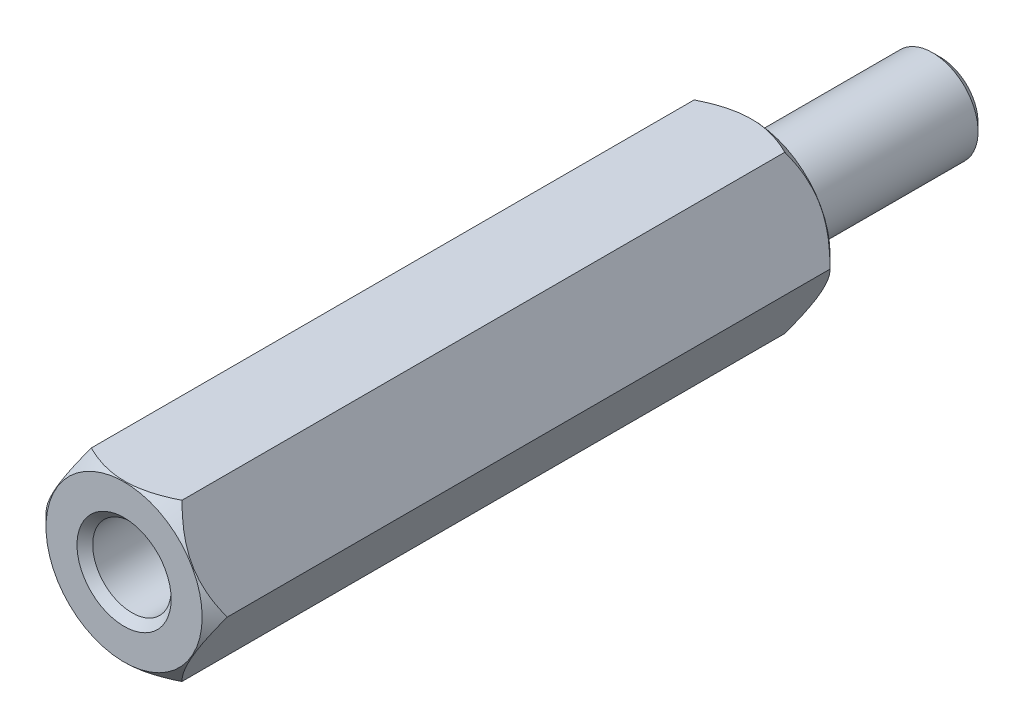
ISO-10303-21;
HEADER;
FILE_DESCRIPTION(('STEP AP214'),'2;1');
FILE_NAME('part.step','',(''),(''),'','','');
FILE_SCHEMA(('AUTOMOTIVE_DESIGN { 1 0 10303 214 1 1 1 1 }'));
ENDSEC;
DATA;
#1=APPLICATION_CONTEXT('core data for automotive mechanical design processes');
#2=APPLICATION_PROTOCOL_DEFINITION('international standard','automotive_design',2000,#1);
#3=PRODUCT_CONTEXT('',#1,'mechanical');
#4=PRODUCT('Part','Part','',(#3));
#5=PRODUCT_RELATED_PRODUCT_CATEGORY('part','',(#4));
#6=PRODUCT_DEFINITION_FORMATION('','',#4);
#7=PRODUCT_DEFINITION_CONTEXT('part definition',#1,'design');
#8=PRODUCT_DEFINITION('design','',#6,#7);
#9=PRODUCT_DEFINITION_SHAPE('','',#8);
#10=(LENGTH_UNIT() NAMED_UNIT(*) SI_UNIT(.MILLI.,.METRE.));
#11=(NAMED_UNIT(*) PLANE_ANGLE_UNIT() SI_UNIT($,.RADIAN.));
#12=(NAMED_UNIT(*) SI_UNIT($,.STERADIAN.) SOLID_ANGLE_UNIT());
#13=UNCERTAINTY_MEASURE_WITH_UNIT(LENGTH_MEASURE(1.E-05),#10,'distance_accuracy_value','');
#14=(GEOMETRIC_REPRESENTATION_CONTEXT(3) GLOBAL_UNCERTAINTY_ASSIGNED_CONTEXT((#13)) GLOBAL_UNIT_ASSIGNED_CONTEXT((#10,
#11,#12)) REPRESENTATION_CONTEXT('',''));
#15=CARTESIAN_POINT('',(0.,0.,0.));
#16=DIRECTION('',(0.,0.,1.));
#17=DIRECTION('',(1.,0.,0.));
#18=AXIS2_PLACEMENT_3D('',#15,#16,#17);
#19=CARTESIAN_POINT('',(0.,0.,10.));
#20=DIRECTION('',(0.,0.,1.));
#21=DIRECTION('',(1.,0.,0.));
#22=AXIS2_PLACEMENT_3D('',#19,#20,#21);
#23=CYLINDRICAL_SURFACE('',#22,1.24999999999999);
#24=CARTESIAN_POINT('',(0.,0.,9.75000000000001));
#25=DIRECTION('',(0.,0.,1.));
#26=DIRECTION('',(1.,0.,0.));
#27=AXIS2_PLACEMENT_3D('',#24,#25,#26);
#28=CIRCLE('',#27,1.24999999999999);
#29=CARTESIAN_POINT('',(1.24999999999999,0.,9.75000000000001));
#30=VERTEX_POINT('',#29);
#31=EDGE_CURVE('E52',#30,#30,#28,.T.);
#32=ORIENTED_EDGE('',*,*,#31,.T.);
#33=EDGE_LOOP('',(#32));
#34=FACE_BOUND('',#33,.T.);
#35=CARTESIAN_POINT('',(0.,0.,-8.));
#36=DIRECTION('',(0.,0.,-1.));
#37=DIRECTION('',(-1.,0.,0.));
#38=AXIS2_PLACEMENT_3D('',#35,#36,#37);
#39=CIRCLE('',#38,1.24999999999999);
#40=CARTESIAN_POINT('',(-1.24999999999999,0.,-8.));
#41=VERTEX_POINT('',#40);
#42=EDGE_CURVE('E119',#41,#41,#39,.F.);
#43=ORIENTED_EDGE('',*,*,#42,.F.);
#44=EDGE_LOOP('',(#43));
#45=FACE_BOUND('',#44,.T.);
#46=ADVANCED_FACE('F42',(#34,#45),#23,.F.);
#47=CARTESIAN_POINT('',(1.44337567297409,-2.49999999999998,10.));
#48=DIRECTION('',(-0.866025403784442,0.499999999999995,0.));
#49=DIRECTION('',(-0.499999999999995,-0.866025403784442,0.));
#50=AXIS2_PLACEMENT_3D('',#47,#48,#49);
#51=PLANE('',#50);
#52=CARTESIAN_POINT('',(1.44326020292026,-2.50019999999999,9.59988452301824));
#53=CARTESIAN_POINT('',(1.49287669073471,-2.41426172221222,9.64945929464527));
#54=CARTESIAN_POINT('',(1.54332283764112,-2.32688643272423,9.69612251863749));
#55=CARTESIAN_POINT('',(1.64618811625262,-2.1487185438344,9.7815618599617));
#56=CARTESIAN_POINT('',(1.69861703122362,-2.05790899931891,9.82029043759399));
#57=CARTESIAN_POINT('',(1.80433744175988,-1.87479587687307,9.88663329610226));
#58=CARTESIAN_POINT('',(1.85760201171318,-1.78253893547065,9.91441433146914));
#59=CARTESIAN_POINT('',(1.96530378549011,-1.5959939912237,9.95721682408933));
#60=CARTESIAN_POINT('',(2.01973769896308,-1.50171168743371,9.97227023332865));
#61=CARTESIAN_POINT('',(2.11355131286834,-1.33922174170815,9.98585227779051));
#62=CARTESIAN_POINT('',(2.15280980880343,-1.27122403211984,9.98786290075919));
#63=CARTESIAN_POINT('',(2.23126263056551,-1.13533975883077,9.98447588281251));
#64=CARTESIAN_POINT('',(2.27045692907359,-1.06745324244775,9.97907564470017));
#65=CARTESIAN_POINT('',(2.34847544336506,-0.932321211763883,9.96117421159752));
#66=CARTESIAN_POINT('',(2.38729919566124,-0.865076500246428,9.94866507295351));
#67=CARTESIAN_POINT('',(2.46427534467605,-0.731749899181788,9.91723249804429));
#68=CARTESIAN_POINT('',(2.50242779262543,-0.66566792090033,9.89830955350318));
#69=CARTESIAN_POINT('',(2.60015256308363,-0.496403653308724,9.84213263859175));
#70=CARTESIAN_POINT('',(2.6591189485299,-0.394270877777098,9.80064416840381));
#71=CARTESIAN_POINT('',(2.74582384890658,-0.244093585059486,9.73060595327691));
#72=CARTESIAN_POINT('',(2.77439698586413,-0.194603460117387,9.70599774788392));
#73=CARTESIAN_POINT('',(2.83101398781794,-0.0965399361611519,9.65453811328476));
#74=CARTESIAN_POINT('',(2.85905816495513,-0.0479659965030718,9.62768806122065));
#75=CARTESIAN_POINT('',(2.88686681600197,0.000199999999999628,9.59988452301824));
#76=B_SPLINE_CURVE_WITH_KNOTS('',3,(#52,#53,#54,#55,#56,#57,#58,#59,#60,#61,#62,#63,#64,#65,#66,
#67,#68,#69,#70,#71,#72,#73,#74,#75),.UNSPECIFIED.,.F.,.F.,(4,2,2,2,2,2,2,2,2,2,2,4),(0.,
0.333012085133922,0.667964518301391,0.99759703204329,1.32639954393843,1.56169424147167,
1.79707142102082,2.0327121352217,2.2683347877565,2.64260240809531,2.82922877818861,
3.01574133749022),.UNSPECIFIED.);
#77=CARTESIAN_POINT('',(1.4433756729741,-2.49999999999999,9.6));
#78=VERTEX_POINT('',#77);
#79=CARTESIAN_POINT('',(2.88675134594813,0.,9.6));
#80=VERTEX_POINT('',#79);
#81=EDGE_CURVE('E96',#78,#80,#76,.T.);
#82=ORIENTED_EDGE('',*,*,#81,.F.);
#83=DIRECTION('',(0.,0.,-1.));
#84=VECTOR('',#83,1.);
#85=CARTESIAN_POINT('',(1.44337567297409,-2.49999999999998,10.));
#86=LINE('',#85,#84);
#87=CARTESIAN_POINT('',(1.44337567297409,-2.49999999999998,-9.60000000000001));
#88=VERTEX_POINT('',#87);
#89=EDGE_CURVE('E67',#78,#88,#86,.T.);
#90=ORIENTED_EDGE('',*,*,#89,.T.);
#91=CARTESIAN_POINT('',(2.88686681600197,0.0002,-9.59988452301824));
#92=CARTESIAN_POINT('',(2.83725032818751,-0.0857382777877641,-9.64945929464528));
#93=CARTESIAN_POINT('',(2.7868041812811,-0.173113567275752,-9.69612251863749));
#94=CARTESIAN_POINT('',(2.68393890266961,-0.351281456165586,-9.7815618599617));
#95=CARTESIAN_POINT('',(2.63150998769861,-0.442091000681072,-9.82029043759399));
#96=CARTESIAN_POINT('',(2.52578957716235,-0.625204123126917,-9.88663329610226));
#97=CARTESIAN_POINT('',(2.47252500720905,-0.717461064529336,-9.91441433146914));
#98=CARTESIAN_POINT('',(2.36482323343211,-0.90400600877628,-9.95721682408933));
#99=CARTESIAN_POINT('',(2.31038931995914,-0.998288312566276,-9.97227023332865));
#100=CARTESIAN_POINT('',(2.21657570605388,-1.16077825829184,-9.98585227779051));
#101=CARTESIAN_POINT('',(2.1773172101188,-1.22877596788014,-9.98786290075919));
#102=CARTESIAN_POINT('',(2.09886438835672,-1.36466024116921,-9.98447588281251));
#103=CARTESIAN_POINT('',(2.05967008984864,-1.43254675755223,-9.97907564470017));
#104=CARTESIAN_POINT('',(1.98165157555716,-1.5676787882361,-9.96117421159752));
#105=CARTESIAN_POINT('',(1.94282782326098,-1.63492349975355,-9.94866507295351));
#106=CARTESIAN_POINT('',(1.86585167424618,-1.76825010081819,-9.91723249804429));
#107=CARTESIAN_POINT('',(1.8276992262968,-1.83433207909965,-9.89830955350318));
#108=CARTESIAN_POINT('',(1.7299744558386,-2.00359634669126,-9.84213263859175));
#109=CARTESIAN_POINT('',(1.67100807039233,-2.10572912222288,-9.80064416840381));
#110=CARTESIAN_POINT('',(1.58430317001565,-2.2559064149405,-9.73060595327691));
#111=CARTESIAN_POINT('',(1.5557300330581,-2.3053965398826,-9.70599774788392));
#112=CARTESIAN_POINT('',(1.49911303110428,-2.40346006383883,-9.65453811328476));
#113=CARTESIAN_POINT('',(1.47106885396709,-2.45203400349691,-9.62768806122065));
#114=CARTESIAN_POINT('',(1.44326020292026,-2.50019999999999,-9.59988452301824));
#115=B_SPLINE_CURVE_WITH_KNOTS('',3,(#91,#92,#93,#94,#95,#96,#97,#98,#99,#100,#101,#102,#103,
#104,#105,#106,#107,#108,#109,#110,#111,#112,#113,#114),.UNSPECIFIED.,.F.,.F.,(4,2,2,2,2,2,2,2,
2,2,2,4),(0.,0.33301208513392,0.667964518301389,0.997597032043288,1.32639954393843,
1.56169424147167,1.79707142102081,2.03271213522169,2.26833478775649,2.64260240809531,
2.82922877818861,3.01574133749022),.UNSPECIFIED.);
#116=CARTESIAN_POINT('',(2.88675134594813,0.,-9.6));
#117=VERTEX_POINT('',#116);
#118=EDGE_CURVE('E117',#117,#88,#115,.T.);
#119=ORIENTED_EDGE('',*,*,#118,.F.);
#120=DIRECTION('',(0.,0.,-1.));
#121=VECTOR('',#120,1.);
#122=CARTESIAN_POINT('',(2.88675134594813,0.,10.));
#123=LINE('',#122,#121);
#124=EDGE_CURVE('E110',#80,#117,#123,.T.);
#125=ORIENTED_EDGE('',*,*,#124,.F.);
#126=EDGE_LOOP('',(#82,#90,#119,#125));
#127=FACE_BOUND('',#126,.T.);
#128=ADVANCED_FACE('F116',(#127),#51,.F.);
#129=CARTESIAN_POINT('',(2.88675134594813,0.,10.));
#130=DIRECTION('',(-0.866025403784438,-0.500000000000001,0.));
#131=DIRECTION('',(0.500000000000001,-0.866025403784438,0.));
#132=AXIS2_PLACEMENT_3D('',#129,#130,#131);
#133=PLANE('',#132);
#134=CARTESIAN_POINT('',(2.88686681600197,-0.000199999999999787,9.59988452301824));
#135=CARTESIAN_POINT('',(2.83725032818751,0.085738277787765,9.64945929464528));
#136=CARTESIAN_POINT('',(2.7868041812811,0.173113567275754,9.6961225186375));
#137=CARTESIAN_POINT('',(2.6839389026696,0.351281456165589,9.7815618599617));
#138=CARTESIAN_POINT('',(2.6315099876986,0.442091000681075,9.820290437594));
#139=CARTESIAN_POINT('',(2.52578957716234,0.625204123126922,9.88663329610226));
#140=CARTESIAN_POINT('',(2.47252500720904,0.717461064529341,9.91441433146915));
#141=CARTESIAN_POINT('',(2.3648232334321,0.904006008776286,9.95721682408934));
#142=CARTESIAN_POINT('',(2.31038931995913,0.998288312566284,9.97227023332866));
#143=CARTESIAN_POINT('',(2.21657570605387,1.16077825829185,9.98585227779052));
#144=CARTESIAN_POINT('',(2.17731721011878,1.22877596788015,9.9878629007592));
#145=CARTESIAN_POINT('',(2.0988643883567,1.36466024116922,9.98447588281252));
#146=CARTESIAN_POINT('',(2.05967008984862,1.43254675755224,9.97907564470018));
#147=CARTESIAN_POINT('',(1.98165157555715,1.56767878823611,9.96117421159753));
#148=CARTESIAN_POINT('',(1.94282782326097,1.63492349975356,9.94866507295352));
#149=CARTESIAN_POINT('',(1.86585167424616,1.7682501008182,9.9172324980443));
#150=CARTESIAN_POINT('',(1.82769922629678,1.83433207909966,9.89830955350319));
#151=CARTESIAN_POINT('',(1.72997445583858,2.00359634669127,9.84213263859176));
#152=CARTESIAN_POINT('',(1.67100807039231,2.1057291222229,9.80064416840382));
#153=CARTESIAN_POINT('',(1.58430317001562,2.25590641494051,9.73060595327692));
#154=CARTESIAN_POINT('',(1.55573003305807,2.30539653988261,9.70599774788393));
#155=CARTESIAN_POINT('',(1.49911303110425,2.40346006383885,9.65453811328477));
#156=CARTESIAN_POINT('',(1.47106885396706,2.45203400349693,9.62768806122065));
#157=CARTESIAN_POINT('',(1.44326020292022,2.50020000000001,9.59988452301824));
#158=B_SPLINE_CURVE_WITH_KNOTS('',3,(#134,#135,#136,#137,#138,#139,#140,#141,#142,#143,#144,
#145,#146,#147,#148,#149,#150,#151,#152,#153,#154,#155,#156,#157),.UNSPECIFIED.,.F.,.F.,(4,2,2,
2,2,2,2,2,2,2,2,4),(0.,0.333012085133925,0.667964518301398,0.9975970320433,1.32639954393844,
1.56169424147169,1.79707142102083,2.03271213522171,2.26833478775651,2.64260240809534,
2.82922877818864,3.01574133749026),.UNSPECIFIED.);
#159=CARTESIAN_POINT('',(1.44337567297406,2.50000000000001,9.6));
#160=VERTEX_POINT('',#159);
#161=EDGE_CURVE('E99',#80,#160,#158,.T.);
#162=ORIENTED_EDGE('',*,*,#161,.F.);
#163=ORIENTED_EDGE('',*,*,#124,.T.);
#164=CARTESIAN_POINT('',(1.44326020292022,2.50020000000001,-9.59988452301824));
#165=CARTESIAN_POINT('',(1.49287669073468,2.41426172221224,-9.64945929464528));
#166=CARTESIAN_POINT('',(1.54332283764109,2.32688643272425,-9.6961225186375));
#167=CARTESIAN_POINT('',(1.64618811625259,2.14871854383442,-9.7815618599617));
#168=CARTESIAN_POINT('',(1.69861703122359,2.05790899931893,-9.820290437594));
#169=CARTESIAN_POINT('',(1.80433744175985,1.87479587687308,-9.88663329610226));
#170=CARTESIAN_POINT('',(1.85760201171315,1.78253893547066,-9.91441433146915));
#171=CARTESIAN_POINT('',(1.96530378549009,1.59599399122372,-9.95721682408934));
#172=CARTESIAN_POINT('',(2.01973769896306,1.50171168743372,-9.97227023332866));
#173=CARTESIAN_POINT('',(2.11355131286832,1.33922174170816,-9.98585227779052));
#174=CARTESIAN_POINT('',(2.15280980880341,1.27122403211985,-9.9878629007592));
#175=CARTESIAN_POINT('',(2.23126263056549,1.13533975883079,-9.98447588281252));
#176=CARTESIAN_POINT('',(2.27045692907357,1.06745324244777,-9.97907564470018));
#177=CARTESIAN_POINT('',(2.34847544336504,0.932321211763899,-9.96117421159753));
#178=CARTESIAN_POINT('',(2.38729919566123,0.865076500246445,-9.94866507295352));
#179=CARTESIAN_POINT('',(2.46427534467603,0.731749899181806,-9.9172324980443));
#180=CARTESIAN_POINT('',(2.50242779262542,0.665667920900348,-9.89830955350319));
#181=CARTESIAN_POINT('',(2.60015256308362,0.49640365330874,-9.84213263859176));
#182=CARTESIAN_POINT('',(2.65911894852989,0.394270877777111,-9.80064416840382));
#183=CARTESIAN_POINT('',(2.74582384890657,0.244093585059494,-9.73060595327692));
#184=CARTESIAN_POINT('',(2.77439698586412,0.194603460117393,-9.70599774788393));
#185=CARTESIAN_POINT('',(2.83101398781794,0.0965399361611548,-9.65453811328477));
#186=CARTESIAN_POINT('',(2.85905816495513,0.0479659965030731,-9.62768806122065));
#187=CARTESIAN_POINT('',(2.88686681600197,-0.000199999999999539,-9.59988452301824));
#188=B_SPLINE_CURVE_WITH_KNOTS('',3,(#164,#165,#166,#167,#168,#169,#170,#171,#172,#173,#174,
#175,#176,#177,#178,#179,#180,#181,#182,#183,#184,#185,#186,#187),.UNSPECIFIED.,.F.,.F.,(4,2,2,
2,2,2,2,2,2,2,2,4),(0.,0.333012085133926,0.6679645183014,0.997597032043303,1.32639954393845,
1.56169424147169,1.79707142102083,2.03271213522171,2.26833478775651,2.64260240809534,
2.82922877818864,3.01574133749026),.UNSPECIFIED.);
#189=CARTESIAN_POINT('',(1.44337567297406,2.50000000000001,-9.6));
#190=VERTEX_POINT('',#189);
#191=EDGE_CURVE('E252',#190,#117,#188,.T.);
#192=ORIENTED_EDGE('',*,*,#191,.F.);
#193=DIRECTION('',(0.,0.,-1.));
#194=VECTOR('',#193,1.);
#195=CARTESIAN_POINT('',(1.44337567297406,2.50000000000001,10.));
#196=LINE('',#195,#194);
#197=EDGE_CURVE('E112',#160,#190,#196,.T.);
#198=ORIENTED_EDGE('',*,*,#197,.F.);
#199=EDGE_LOOP('',(#162,#163,#192,#198));
#200=FACE_BOUND('',#199,.T.);
#201=ADVANCED_FACE('F108',(#200),#133,.F.);
#202=CARTESIAN_POINT('',(1.44337567297406,2.50000000000001,10.));
#203=DIRECTION('',(0.,-1.,0.));
#204=DIRECTION('',(1.,0.,0.));
#205=AXIS2_PLACEMENT_3D('',#202,#203,#204);
#206=PLANE('',#205);
#207=CARTESIAN_POINT('',(4.35790807222665,2.50000000000002,7.46267304580409));
#208=CARTESIAN_POINT('',(4.22900505074815,2.50000000000001,7.57444020651168));
#209=CARTESIAN_POINT('',(4.09952897907173,2.50000000000001,7.68556009439584));
#210=CARTESIAN_POINT('',(3.83898638028681,2.50000000000001,7.90604374915114));
#211=CARTESIAN_POINT('',(3.70791912620545,2.50000000000001,8.01540665588043));
#212=CARTESIAN_POINT('',(3.44083760855067,2.50000000000001,8.23429407491961));
#213=CARTESIAN_POINT('',(3.30477887797079,2.50000000000001,8.34376454299069));
#214=CARTESIAN_POINT('',(3.03009587684347,2.50000000000001,8.55938263287972));
#215=CARTESIAN_POINT('',(2.89147225782007,2.50000000000001,8.6655310805966));
#216=CARTESIAN_POINT('',(2.61062429451692,2.50000000000001,8.87338578520497));
#217=CARTESIAN_POINT('',(2.46839537969833,2.50000000000001,8.97508590704005));
#218=CARTESIAN_POINT('',(2.17925486790779,2.50000000000001,9.17194970638112));
#219=CARTESIAN_POINT('',(2.03233957265131,2.50000000000001,9.26710802470617));
#220=CARTESIAN_POINT('',(1.73361597358268,2.50000000000001,9.44680833734888));
#221=CARTESIAN_POINT('',(1.58185407011246,2.50000000000001,9.5314264527755));
#222=CARTESIAN_POINT('',(1.27084130527911,2.5,9.68552599595446));
#223=CARTESIAN_POINT('',(1.11160488303032,2.5,9.75503525688873));
#224=CARTESIAN_POINT('',(0.864657376231804,2.5,9.84259642513528));
#225=CARTESIAN_POINT('',(0.77999302622252,2.5,9.86920046305057));
#226=CARTESIAN_POINT('',(0.608668935092173,2.5,9.91504582346073));
#227=CARTESIAN_POINT('',(0.522009514777892,2.5,9.93428832104285));
#228=CARTESIAN_POINT('',(0.347739556932336,2.5,9.9641318069513));
#229=CARTESIAN_POINT('',(0.260138222188822,2.5,9.97478552783329));
#230=CARTESIAN_POINT('',(0.0842961272603139,2.5,9.98686770307153));
#231=CARTESIAN_POINT('',(-0.00394456438844589,2.5,9.98829713200226));
#232=CARTESIAN_POINT('',(-0.180192018780213,2.5,9.98181608276146));
#233=CARTESIAN_POINT('',(-0.268198313940587,2.5,9.97389317264444));
#234=CARTESIAN_POINT('',(-0.442968473014178,2.5,9.94928693602144));
#235=CARTESIAN_POINT('',(-0.529732088460509,2.5,9.93260188201526));
#236=CARTESIAN_POINT('',(-0.70200364163614,2.5,9.89141807606219));
#237=CARTESIAN_POINT('',(-0.787498274243356,2.5,9.86686463906262));
#238=CARTESIAN_POINT('',(-0.956318998116786,2.5,9.81127227919823));
#239=CARTESIAN_POINT('',(-1.03964506444263,2.5,9.78023328178095));
#240=CARTESIAN_POINT('',(-1.22260914379837,2.5,9.70532752613879));
#241=CARTESIAN_POINT('',(-1.32170415747565,2.5,9.66014559308747));
#242=CARTESIAN_POINT('',(-1.51694385371061,2.49999999999999,9.56375515379207));
#243=CARTESIAN_POINT('',(-1.61308679170487,2.49999999999999,9.51254316726495));
#244=CARTESIAN_POINT('',(-1.80296614219631,2.49999999999999,9.40543166741101));
#245=CARTESIAN_POINT('',(-1.89669715950609,2.49999999999999,9.34952266760245));
#246=CARTESIAN_POINT('',(-2.08192800240941,2.49999999999999,9.23418674307865));
#247=CARTESIAN_POINT('',(-2.17342826625815,2.49999999999999,9.17476051735267));
#248=CARTESIAN_POINT('',(-2.35505847652762,2.49999999999999,9.05284030367592));
#249=CARTESIAN_POINT('',(-2.44517856997304,2.49999999999999,8.99033170499245));
#250=CARTESIAN_POINT('',(-2.62385919422449,2.49999999999999,8.86311875000847));
#251=CARTESIAN_POINT('',(-2.71241960671455,2.49999999999999,8.79841422820775));
#252=CARTESIAN_POINT('',(-2.97593968609535,2.49999999999999,8.60184992046111));
#253=CARTESIAN_POINT('',(-3.14895696314842,2.49999999999999,8.46738929484149));
#254=CARTESIAN_POINT('',(-3.49727644035017,2.49999999999999,8.18911816701068));
#255=CARTESIAN_POINT('',(-3.6724475097082,2.49999999999999,8.04514512901893));
#256=CARTESIAN_POINT('',(-3.9321211000153,2.49999999999999,7.82741624538674));
#257=CARTESIAN_POINT('',(-4.01770626505476,2.49999999999999,7.75494531232854));
#258=CARTESIAN_POINT('',(-4.18824952148341,2.49999999999999,7.60930608888149));
#259=CARTESIAN_POINT('',(-4.2732077442148,2.49999999999999,7.53613795236393));
#260=CARTESIAN_POINT('',(-4.35790807222667,2.49999999999999,7.46267304580409));
#261=B_SPLINE_CURVE_WITH_KNOTS('',3,(#207,#208,#209,#210,#211,#212,#213,#214,#215,#216,#217,
#218,#219,#220,#221,#222,#223,#224,#225,#226,#227,#228,#229,#230,#231,#232,#233,#234,#235,#236,
#237,#238,#239,#240,#241,#242,#243,#244,#245,#246,#247,#248,#249,#250,#251,#252,#253,#254,#255,
#256,#257,#258,#259,#260),.UNSPECIFIED.,.F.,.F.,(4,2,2,2,2,2,2,2,2,2,2,2,2,2,2,2,2,2,2,2,2,2,2,
2,2,2,4),(0.,0.511842212813337,1.02392780167291,1.54778169920521,2.0715043079768,
2.59592780979257,3.12077593308527,3.6415817306556,4.16141982425733,4.42739176689035,
4.69332123596952,4.95760526901695,5.22186137919605,5.4864691576042,5.75112912434679,
6.01766988465734,6.28421370906123,6.61066447125655,6.93730457870706,7.26462103112129,
7.59187265192317,7.92086150920113,8.24987521669916,8.90710736338424,9.58728616124552,
9.92372274140157,10.2600867154781),.UNSPECIFIED.);
#262=CARTESIAN_POINT('',(-1.44337567297408,2.5,9.6));
#263=VERTEX_POINT('',#262);
#264=EDGE_CURVE('E114',#160,#263,#261,.T.);
#265=ORIENTED_EDGE('',*,*,#264,.F.);
#266=ORIENTED_EDGE('',*,*,#197,.T.);
#267=CARTESIAN_POINT('',(-4.35790807222667,2.49999999999999,-7.46267304580409));
#268=CARTESIAN_POINT('',(-4.22900505074817,2.49999999999999,-7.57444020651168));
#269=CARTESIAN_POINT('',(-4.09952897907174,2.49999999999999,-7.68556009439584));
#270=CARTESIAN_POINT('',(-3.83898638028682,2.49999999999999,-7.90604374915114));
#271=CARTESIAN_POINT('',(-3.70791912620547,2.49999999999999,-8.01540665588043));
#272=CARTESIAN_POINT('',(-3.44083760855069,2.49999999999999,-8.23429407491961));
#273=CARTESIAN_POINT('',(-3.30477887797081,2.49999999999999,-8.34376454299069));
#274=CARTESIAN_POINT('',(-3.03009587684349,2.49999999999999,-8.55938263287972));
#275=CARTESIAN_POINT('',(-2.89147225782008,2.49999999999999,-8.6655310805966));
#276=CARTESIAN_POINT('',(-2.61062429451694,2.49999999999999,-8.87338578520497));
#277=CARTESIAN_POINT('',(-2.46839537969835,2.49999999999999,-8.97508590704005));
#278=CARTESIAN_POINT('',(-2.17925486790781,2.49999999999999,-9.17194970638112));
#279=CARTESIAN_POINT('',(-2.03233957265133,2.49999999999999,-9.26710802470617));
#280=CARTESIAN_POINT('',(-1.7336159735827,2.49999999999999,-9.44680833734888));
#281=CARTESIAN_POINT('',(-1.58185407011247,2.49999999999999,-9.5314264527755));
#282=CARTESIAN_POINT('',(-1.27084130527912,2.5,-9.68552599595446));
#283=CARTESIAN_POINT('',(-1.11160488303033,2.5,-9.75503525688873));
#284=CARTESIAN_POINT('',(-0.864657376231821,2.5,-9.84259642513528));
#285=CARTESIAN_POINT('',(-0.779993026222537,2.5,-9.86920046305057));
#286=CARTESIAN_POINT('',(-0.608668935092189,2.5,-9.91504582346073));
#287=CARTESIAN_POINT('',(-0.522009514777909,2.5,-9.93428832104285));
#288=CARTESIAN_POINT('',(-0.347739556932353,2.5,-9.9641318069513));
#289=CARTESIAN_POINT('',(-0.260138222188839,2.5,-9.97478552783329));
#290=CARTESIAN_POINT('',(-0.0842961272603305,2.5,-9.98686770307153));
#291=CARTESIAN_POINT('',(0.0039445643884292,2.5,-9.98829713200226));
#292=CARTESIAN_POINT('',(0.180192018780197,2.5,-9.98181608276146));
#293=CARTESIAN_POINT('',(0.26819831394057,2.5,-9.97389317264444));
#294=CARTESIAN_POINT('',(0.442968473014161,2.5,-9.94928693602144));
#295=CARTESIAN_POINT('',(0.529732088460492,2.5,-9.93260188201526));
#296=CARTESIAN_POINT('',(0.702003641636123,2.5,-9.89141807606219));
#297=CARTESIAN_POINT('',(0.78749827424334,2.5,-9.86686463906262));
#298=CARTESIAN_POINT('',(0.956318998116769,2.5,-9.81127227919823));
#299=CARTESIAN_POINT('',(1.03964506444261,2.5,-9.78023328178095));
#300=CARTESIAN_POINT('',(1.22260914379835,2.5,-9.70532752613879));
#301=CARTESIAN_POINT('',(1.32170415747563,2.5,-9.66014559308747));
#302=CARTESIAN_POINT('',(1.51694385371059,2.50000000000001,-9.56375515379207));
#303=CARTESIAN_POINT('',(1.61308679170485,2.50000000000001,-9.51254316726495));
#304=CARTESIAN_POINT('',(1.80296614219629,2.50000000000001,-9.40543166741101));
#305=CARTESIAN_POINT('',(1.89669715950607,2.50000000000001,-9.34952266760245));
#306=CARTESIAN_POINT('',(2.08192800240939,2.50000000000001,-9.23418674307865));
#307=CARTESIAN_POINT('',(2.17342826625813,2.50000000000001,-9.17476051735267));
#308=CARTESIAN_POINT('',(2.3550584765276,2.50000000000001,-9.05284030367592));
#309=CARTESIAN_POINT('',(2.44517856997302,2.50000000000001,-8.99033170499245));
#310=CARTESIAN_POINT('',(2.62385919422447,2.50000000000001,-8.86311875000847));
#311=CARTESIAN_POINT('',(2.71241960671454,2.50000000000001,-8.79841422820775));
#312=CARTESIAN_POINT('',(2.97593968609533,2.50000000000001,-8.60184992046111));
#313=CARTESIAN_POINT('',(3.14895696314841,2.50000000000001,-8.46738929484149));
#314=CARTESIAN_POINT('',(3.49727644035015,2.50000000000001,-8.18911816701068));
#315=CARTESIAN_POINT('',(3.67244750970818,2.50000000000001,-8.04514512901893));
#316=CARTESIAN_POINT('',(3.93212110001529,2.50000000000001,-7.82741624538673));
#317=CARTESIAN_POINT('',(4.01770626505474,2.50000000000001,-7.75494531232854));
#318=CARTESIAN_POINT('',(4.18824952148339,2.50000000000001,-7.60930608888149));
#319=CARTESIAN_POINT('',(4.27320774421478,2.50000000000001,-7.53613795236393));
#320=CARTESIAN_POINT('',(4.35790807222665,2.50000000000002,-7.46267304580409));
#321=B_SPLINE_CURVE_WITH_KNOTS('',3,(#267,#268,#269,#270,#271,#272,#273,#274,#275,#276,#277,
#278,#279,#280,#281,#282,#283,#284,#285,#286,#287,#288,#289,#290,#291,#292,#293,#294,#295,#296,
#297,#298,#299,#300,#301,#302,#303,#304,#305,#306,#307,#308,#309,#310,#311,#312,#313,#314,#315,
#316,#317,#318,#319,#320),.UNSPECIFIED.,.F.,.F.,(4,2,2,2,2,2,2,2,2,2,2,2,2,2,2,2,2,2,2,2,2,2,2,
2,2,2,4),(0.,0.511842212813336,1.02392780167291,1.54778169920521,2.0715043079768,
2.59592780979257,3.12077593308528,3.6415817306556,4.16141982425734,4.42739176689035,
4.69332123596952,4.95760526901695,5.22186137919605,5.4864691576042,5.75112912434679,
6.01766988465734,6.28421370906123,6.61066447125655,6.93730457870706,7.2646210311213,
7.59187265192318,7.92086150920113,8.24987521669917,8.90710736338424,9.58728616124552,
9.92372274140157,10.2600867154781),.UNSPECIFIED.);
#322=CARTESIAN_POINT('',(-1.44337567297408,2.5,-9.6));
#323=VERTEX_POINT('',#322);
#324=EDGE_CURVE('E260',#323,#190,#321,.T.);
#325=ORIENTED_EDGE('',*,*,#324,.F.);
#326=DIRECTION('',(0.,0.,-1.));
#327=VECTOR('',#326,1.);
#328=CARTESIAN_POINT('',(-1.44337567297408,2.5,10.));
#329=LINE('',#328,#327);
#330=EDGE_CURVE('E128',#263,#323,#329,.T.);
#331=ORIENTED_EDGE('',*,*,#330,.F.);
#332=EDGE_LOOP('',(#265,#266,#325,#331));
#333=FACE_BOUND('',#332,.T.);
#334=ADVANCED_FACE('F246',(#333),#206,.F.);
#335=CARTESIAN_POINT('',(-1.44337567297408,2.5,10.));
#336=DIRECTION('',(0.866025403784442,-0.499999999999995,0.));
#337=DIRECTION('',(0.499999999999995,0.866025403784442,0.));
#338=AXIS2_PLACEMENT_3D('',#335,#336,#337);
#339=PLANE('',#338);
#340=CARTESIAN_POINT('',(-1.44326020292024,2.5002,9.59988452301824));
#341=CARTESIAN_POINT('',(-1.4928766907347,2.41426172221223,9.64945929464528));
#342=CARTESIAN_POINT('',(-1.54332283764111,2.32688643272424,9.6961225186375));
#343=CARTESIAN_POINT('',(-1.6461881162526,2.14871854383441,9.7815618599617));
#344=CARTESIAN_POINT('',(-1.6986170312236,2.05790899931892,9.820290437594));
#345=CARTESIAN_POINT('',(-1.80433744175987,1.87479587687307,9.88663329610226));
#346=CARTESIAN_POINT('',(-1.85760201171316,1.78253893547065,9.91441433146915));
#347=CARTESIAN_POINT('',(-1.9653037854901,1.5959939912237,9.95721682408934));
#348=CARTESIAN_POINT('',(-2.01973769896307,1.50171168743371,9.97227023332866));
#349=CARTESIAN_POINT('',(-2.11355131286833,1.33922174170814,9.98585227779052));
#350=CARTESIAN_POINT('',(-2.15280980880342,1.27122403211984,9.9878629007592));
#351=CARTESIAN_POINT('',(-2.2312626305655,1.13533975883077,9.98447588281252));
#352=CARTESIAN_POINT('',(-2.27045692907358,1.06745324244775,9.97907564470018));
#353=CARTESIAN_POINT('',(-2.34847544336505,0.932321211763883,9.96117421159753));
#354=CARTESIAN_POINT('',(-2.38729919566123,0.865076500246428,9.94866507295352));
#355=CARTESIAN_POINT('',(-2.46427534467604,0.731749899181789,9.9172324980443));
#356=CARTESIAN_POINT('',(-2.50242779262542,0.665667920900331,9.89830955350319));
#357=CARTESIAN_POINT('',(-2.60015256308362,0.496403653308722,9.84213263859176));
#358=CARTESIAN_POINT('',(-2.65911894852989,0.394270877777092,9.80064416840382));
#359=CARTESIAN_POINT('',(-2.74582384890657,0.244093585059475,9.73060595327692));
#360=CARTESIAN_POINT('',(-2.77439698586412,0.194603460117374,9.70599774788393));
#361=CARTESIAN_POINT('',(-2.83101398781794,0.0965399361611354,9.65453811328477));
#362=CARTESIAN_POINT('',(-2.85905816495513,0.0479659965030536,9.62768806122065));
#363=CARTESIAN_POINT('',(-2.88686681600197,-0.000200000000019625,9.59988452301824));
#364=B_SPLINE_CURVE_WITH_KNOTS('',3,(#340,#341,#342,#343,#344,#345,#346,#347,#348,#349,#350,
#351,#352,#353,#354,#355,#356,#357,#358,#359,#360,#361,#362,#363),.UNSPECIFIED.,.F.,.F.,(4,2,2,
2,2,2,2,2,2,2,2,4),(0.,0.333012085133925,0.667964518301399,0.997597032043302,1.32639954393845,
1.56169424147169,1.79707142102083,2.03271213522171,2.26833478775651,2.64260240809534,
2.82922877818864,3.01574133749026),.UNSPECIFIED.);
#365=CARTESIAN_POINT('',(-2.88675134594813,0.,9.6));
#366=VERTEX_POINT('',#365);
#367=EDGE_CURVE('E224',#263,#366,#364,.T.);
#368=ORIENTED_EDGE('',*,*,#367,.F.);
#369=ORIENTED_EDGE('',*,*,#330,.T.);
#370=CARTESIAN_POINT('',(-2.88686681600197,-0.000200000000020158,-9.59988452301824));
#371=CARTESIAN_POINT('',(-2.83725032818751,0.0857382777877453,-9.64945929464528));
#372=CARTESIAN_POINT('',(-2.7868041812811,0.173113567275734,-9.6961225186375));
#373=CARTESIAN_POINT('',(-2.68393890266961,0.351281456165571,-9.7815618599617));
#374=CARTESIAN_POINT('',(-2.6315099876986,0.442091000681057,-9.820290437594));
#375=CARTESIAN_POINT('',(-2.52578957716234,0.625204123126904,-9.88663329610226));
#376=CARTESIAN_POINT('',(-2.47252500720904,0.717461064529324,-9.91441433146915));
#377=CARTESIAN_POINT('',(-2.36482323343211,0.90400600877627,-9.95721682408934));
#378=CARTESIAN_POINT('',(-2.31038931995913,0.998288312566268,-9.97227023332866));
#379=CARTESIAN_POINT('',(-2.21657570605388,1.16077825829183,-9.98585227779052));
#380=CARTESIAN_POINT('',(-2.17731721011879,1.22877596788014,-9.9878629007592));
#381=CARTESIAN_POINT('',(-2.09886438835671,1.3646602411692,-9.98447588281252));
#382=CARTESIAN_POINT('',(-2.05967008984863,1.43254675755222,-9.97907564470018));
#383=CARTESIAN_POINT('',(-1.98165157555716,1.56767878823609,-9.96117421159753));
#384=CARTESIAN_POINT('',(-1.94282782326098,1.63492349975355,-9.94866507295352));
#385=CARTESIAN_POINT('',(-1.86585167424617,1.76825010081819,-9.9172324980443));
#386=CARTESIAN_POINT('',(-1.82769922629679,1.83433207909964,-9.89830955350319));
#387=CARTESIAN_POINT('',(-1.72997445583859,2.00359634669125,-9.84213263859176));
#388=CARTESIAN_POINT('',(-1.67100807039232,2.10572912222288,-9.80064416840382));
#389=CARTESIAN_POINT('',(-1.58430317001564,2.2559064149405,-9.73060595327692));
#390=CARTESIAN_POINT('',(-1.55573003305809,2.3053965398826,-9.70599774788393));
#391=CARTESIAN_POINT('',(-1.49911303110427,2.40346006383884,-9.65453811328477));
#392=CARTESIAN_POINT('',(-1.47106885396707,2.45203400349692,-9.62768806122065));
#393=CARTESIAN_POINT('',(-1.44326020292024,2.5002,-9.59988452301824));
#394=B_SPLINE_CURVE_WITH_KNOTS('',3,(#370,#371,#372,#373,#374,#375,#376,#377,#378,#379,#380,
#381,#382,#383,#384,#385,#386,#387,#388,#389,#390,#391,#392,#393),.UNSPECIFIED.,.F.,.F.,(4,2,2,
2,2,2,2,2,2,2,2,4),(0.,0.333012085133925,0.667964518301398,0.997597032043301,1.32639954393844,
1.56169424147169,1.79707142102083,2.03271213522171,2.26833478775651,2.64260240809534,
2.82922877818864,3.01574133749026),.UNSPECIFIED.);
#395=CARTESIAN_POINT('',(-2.88675134594813,0.,-9.6));
#396=VERTEX_POINT('',#395);
#397=EDGE_CURVE('E287',#396,#323,#394,.T.);
#398=ORIENTED_EDGE('',*,*,#397,.F.);
#399=DIRECTION('',(0.,0.,-1.));
#400=VECTOR('',#399,1.);
#401=CARTESIAN_POINT('',(-2.88675134594813,0.,10.));
#402=LINE('',#401,#400);
#403=EDGE_CURVE('E277',#366,#396,#402,.T.);
#404=ORIENTED_EDGE('',*,*,#403,.F.);
#405=EDGE_LOOP('',(#368,#369,#398,#404));
#406=FACE_BOUND('',#405,.T.);
#407=ADVANCED_FACE('F285',(#406),#339,.F.);
#408=CARTESIAN_POINT('',(-2.88675134594813,0.,10.));
#409=DIRECTION('',(0.866025403784435,0.500000000000007,0.));
#410=DIRECTION('',(-0.500000000000007,0.866025403784435,0.));
#411=AXIS2_PLACEMENT_3D('',#408,#409,#410);
#412=PLANE('',#411);
#413=CARTESIAN_POINT('',(-2.88686681600197,0.000199999999979628,9.59988452301824));
#414=CARTESIAN_POINT('',(-2.83725032818751,-0.0857382777877848,9.64945929464528));
#415=CARTESIAN_POINT('',(-2.7868041812811,-0.173113567275773,9.6961225186375));
#416=CARTESIAN_POINT('',(-2.6839389026696,-0.351281456165609,9.7815618599617));
#417=CARTESIAN_POINT('',(-2.6315099876986,-0.442091000681095,9.820290437594));
#418=CARTESIAN_POINT('',(-2.52578957716233,-0.625204123126941,9.88663329610226));
#419=CARTESIAN_POINT('',(-2.47252500720903,-0.71746106452936,9.91441433146915));
#420=CARTESIAN_POINT('',(-2.36482323343209,-0.904006008776305,9.95721682408934));
#421=CARTESIAN_POINT('',(-2.31038931995912,-0.998288312566302,9.97227023332866));
#422=CARTESIAN_POINT('',(-2.21657570605386,-1.16077825829186,9.98585227779052));
#423=CARTESIAN_POINT('',(-2.17731721011877,-1.22877596788017,9.9878629007592));
#424=CARTESIAN_POINT('',(-2.09886438835669,-1.36466024116924,9.98447588281252));
#425=CARTESIAN_POINT('',(-2.05967008984861,-1.43254675755225,9.97907564470018));
#426=CARTESIAN_POINT('',(-1.98165157555713,-1.56767878823612,9.96117421159753));
#427=CARTESIAN_POINT('',(-1.94282782326095,-1.63492349975358,9.94866507295352));
#428=CARTESIAN_POINT('',(-1.86585167424615,-1.76825010081821,9.9172324980443));
#429=CARTESIAN_POINT('',(-1.82769922629676,-1.83433207909967,9.89830955350319));
#430=CARTESIAN_POINT('',(-1.72997445583856,-2.00359634669128,9.84213263859176));
#431=CARTESIAN_POINT('',(-1.67100807039229,-2.10572912222291,9.80064416840382));
#432=CARTESIAN_POINT('',(-1.5843031700156,-2.25590641494052,9.73060595327692));
#433=CARTESIAN_POINT('',(-1.55573003305805,-2.30539653988262,9.70599774788393));
#434=CARTESIAN_POINT('',(-1.49911303110424,-2.40346006383886,9.65453811328477));
#435=CARTESIAN_POINT('',(-1.47106885396704,-2.45203400349694,9.62768806122065));
#436=CARTESIAN_POINT('',(-1.4432602029202,-2.50020000000001,9.59988452301824));
#437=B_SPLINE_CURVE_WITH_KNOTS('',3,(#413,#414,#415,#416,#417,#418,#419,#420,#421,#422,#423,
#424,#425,#426,#427,#428,#429,#430,#431,#432,#433,#434,#435,#436),.UNSPECIFIED.,.F.,.F.,(4,2,2,
2,2,2,2,2,2,2,2,4),(0.,0.333012085133925,0.667964518301399,0.997597032043303,1.32639954393845,
1.56169424147169,1.79707142102083,2.03271213522171,2.26833478775651,2.64260240809534,
2.82922877818864,3.01574133749025),.UNSPECIFIED.);
#438=CARTESIAN_POINT('',(-1.44337567297404,-2.50000000000001,9.6));
#439=VERTEX_POINT('',#438);
#440=EDGE_CURVE('E59',#366,#439,#437,.T.);
#441=ORIENTED_EDGE('',*,*,#440,.F.);
#442=ORIENTED_EDGE('',*,*,#403,.T.);
#443=CARTESIAN_POINT('',(-1.4432602029202,-2.50020000000001,-9.59988452301824));
#444=CARTESIAN_POINT('',(-1.49287669073466,-2.41426172221225,-9.64945929464528));
#445=CARTESIAN_POINT('',(-1.54332283764108,-2.32688643272426,-9.6961225186375));
#446=CARTESIAN_POINT('',(-1.64618811625257,-2.14871854383443,-9.7815618599617));
#447=CARTESIAN_POINT('',(-1.69861703122358,-2.05790899931894,-9.820290437594));
#448=CARTESIAN_POINT('',(-1.80433744175984,-1.8747958768731,-9.88663329610226));
#449=CARTESIAN_POINT('',(-1.85760201171314,-1.78253893547068,-9.91441433146915));
#450=CARTESIAN_POINT('',(-1.96530378549008,-1.59599399122373,-9.95721682408934));
#451=CARTESIAN_POINT('',(-2.01973769896305,-1.50171168743373,-9.97227023332866));
#452=CARTESIAN_POINT('',(-2.11355131286831,-1.33922174170817,-9.98585227779052));
#453=CARTESIAN_POINT('',(-2.1528098088034,-1.27122403211987,-9.9878629007592));
#454=CARTESIAN_POINT('',(-2.23126263056548,-1.1353397588308,-9.98447588281252));
#455=CARTESIAN_POINT('',(-2.27045692907357,-1.06745324244778,-9.97907564470018));
#456=CARTESIAN_POINT('',(-2.34847544336504,-0.932321211763915,-9.96117421159753));
#457=CARTESIAN_POINT('',(-2.38729919566122,-0.865076500246461,-9.94866507295352));
#458=CARTESIAN_POINT('',(-2.46427534467603,-0.731749899181823,-9.9172324980443));
#459=CARTESIAN_POINT('',(-2.50242779262541,-0.665667920900365,-9.89830955350319));
#460=CARTESIAN_POINT('',(-2.60015256308361,-0.496403653308758,-9.84213263859176));
#461=CARTESIAN_POINT('',(-2.65911894852988,-0.394270877777129,-9.80064416840382));
#462=CARTESIAN_POINT('',(-2.74582384890657,-0.244093585059513,-9.73060595327692));
#463=CARTESIAN_POINT('',(-2.77439698586412,-0.194603460117412,-9.70599774788393));
#464=CARTESIAN_POINT('',(-2.83101398781794,-0.0965399361611742,-9.65453811328477));
#465=CARTESIAN_POINT('',(-2.85905816495513,-0.0479659965030929,-9.62768806122065));
#466=CARTESIAN_POINT('',(-2.88686681600197,0.00019999999997943,-9.59988452301824));
#467=B_SPLINE_CURVE_WITH_KNOTS('',3,(#443,#444,#445,#446,#447,#448,#449,#450,#451,#452,#453,
#454,#455,#456,#457,#458,#459,#460,#461,#462,#463,#464,#465,#466),.UNSPECIFIED.,.F.,.F.,(4,2,2,
2,2,2,2,2,2,2,2,4),(0.,0.333012085133925,0.667964518301398,0.997597032043302,1.32639954393845,
1.56169424147169,1.79707142102083,2.03271213522171,2.26833478775651,2.64260240809533,
2.82922877818864,3.01574133749025),.UNSPECIFIED.);
#468=CARTESIAN_POINT('',(-1.44337567297404,-2.50000000000002,-9.6));
#469=VERTEX_POINT('',#468);
#470=EDGE_CURVE('E295',#469,#396,#467,.T.);
#471=ORIENTED_EDGE('',*,*,#470,.F.);
#472=DIRECTION('',(0.,0.,-1.));
#473=VECTOR('',#472,1.);
#474=CARTESIAN_POINT('',(-1.44337567297404,-2.50000000000001,10.));
#475=LINE('',#474,#473);
#476=EDGE_CURVE('E274',#439,#469,#475,.T.);
#477=ORIENTED_EDGE('',*,*,#476,.F.);
#478=EDGE_LOOP('',(#441,#442,#471,#477));
#479=FACE_BOUND('',#478,.T.);
#480=ADVANCED_FACE('F185',(#479),#412,.F.);
#481=CARTESIAN_POINT('',(-1.44337567297404,-2.50000000000001,10.));
#482=DIRECTION('',(0.,1.,0.));
#483=DIRECTION('',(-1.,0.,0.));
#484=AXIS2_PLACEMENT_3D('',#481,#482,#483);
#485=PLANE('',#484);
#486=CARTESIAN_POINT('',(-4.35790807222664,-2.50000000000005,7.46267304580409));
#487=CARTESIAN_POINT('',(-4.22900505074813,-2.50000000000004,7.57444020651168));
#488=CARTESIAN_POINT('',(-4.09952897907171,-2.50000000000004,7.68556009439584));
#489=CARTESIAN_POINT('',(-3.83898638028679,-2.50000000000004,7.90604374915114));
#490=CARTESIAN_POINT('',(-3.70791912620543,-2.50000000000004,8.01540665588043));
#491=CARTESIAN_POINT('',(-3.44083760855066,-2.50000000000004,8.23429407491961));
#492=CARTESIAN_POINT('',(-3.30477887797077,-2.50000000000003,8.34376454299069));
#493=CARTESIAN_POINT('',(-3.03009587684345,-2.50000000000003,8.55938263287972));
#494=CARTESIAN_POINT('',(-2.89147225782005,-2.50000000000003,8.6655310805966));
#495=CARTESIAN_POINT('',(-2.6106242945169,-2.50000000000003,8.87338578520497));
#496=CARTESIAN_POINT('',(-2.46839537969832,-2.50000000000003,8.97508590704005));
#497=CARTESIAN_POINT('',(-2.17925486790777,-2.50000000000002,9.17194970638112));
#498=CARTESIAN_POINT('',(-2.0323395726513,-2.50000000000002,9.26710802470617));
#499=CARTESIAN_POINT('',(-1.73361597358266,-2.50000000000002,9.44680833734888));
#500=CARTESIAN_POINT('',(-1.58185407011244,-2.50000000000002,9.5314264527755));
#501=CARTESIAN_POINT('',(-1.27084130527909,-2.50000000000001,9.68552599595446));
#502=CARTESIAN_POINT('',(-1.1116048830303,-2.50000000000001,9.75503525688873));
#503=CARTESIAN_POINT('',(-0.864657376231788,-2.50000000000001,9.84259642513528));
#504=CARTESIAN_POINT('',(-0.779993026222503,-2.50000000000001,9.86920046305057));
#505=CARTESIAN_POINT('',(-0.608668935092156,-2.50000000000001,9.91504582346073));
#506=CARTESIAN_POINT('',(-0.522009514777876,-2.50000000000001,9.93428832104285));
#507=CARTESIAN_POINT('',(-0.347739556932319,-2.5,9.9641318069513));
#508=CARTESIAN_POINT('',(-0.260138222188806,-2.5,9.97478552783329));
#509=CARTESIAN_POINT('',(-0.0842961272602973,-2.5,9.98686770307153));
#510=CARTESIAN_POINT('',(0.00394456438846237,-2.5,9.98829713200227));
#511=CARTESIAN_POINT('',(0.18019201878023,-2.5,9.98181608276146));
#512=CARTESIAN_POINT('',(0.268198313940603,-2.5,9.97389317264444));
#513=CARTESIAN_POINT('',(0.442968473014194,-2.5,9.94928693602144));
#514=CARTESIAN_POINT('',(0.529732088460525,-2.49999999999999,9.93260188201526));
#515=CARTESIAN_POINT('',(0.702003641636157,-2.49999999999999,9.89141807606219));
#516=CARTESIAN_POINT('',(0.787498274243373,-2.49999999999999,9.86686463906262));
#517=CARTESIAN_POINT('',(0.956318998116803,-2.49999999999999,9.81127227919823));
#518=CARTESIAN_POINT('',(1.03964506444265,-2.49999999999999,9.78023328178095));
#519=CARTESIAN_POINT('',(1.22260914379838,-2.49999999999999,9.70532752613879));
#520=CARTESIAN_POINT('',(1.32170415747567,-2.49999999999999,9.66014559308748));
#521=CARTESIAN_POINT('',(1.51694385371063,-2.49999999999998,9.56375515379207));
#522=CARTESIAN_POINT('',(1.61308679170488,-2.49999999999998,9.51254316726495));
#523=CARTESIAN_POINT('',(1.80296614219632,-2.49999999999998,9.40543166741101));
#524=CARTESIAN_POINT('',(1.8966971595061,-2.49999999999998,9.34952266760245));
#525=CARTESIAN_POINT('',(2.08192800240943,-2.49999999999998,9.23418674307865));
#526=CARTESIAN_POINT('',(2.17342826625817,-2.49999999999998,9.17476051735267));
#527=CARTESIAN_POINT('',(2.35505847652763,-2.49999999999998,9.05284030367593));
#528=CARTESIAN_POINT('',(2.44517856997305,-2.49999999999997,8.99033170499245));
#529=CARTESIAN_POINT('',(2.62385919422451,-2.49999999999997,8.86311875000847));
#530=CARTESIAN_POINT('',(2.71241960671457,-2.49999999999997,8.79841422820775));
#531=CARTESIAN_POINT('',(2.97593968609536,-2.49999999999997,8.60184992046111));
#532=CARTESIAN_POINT('',(3.14895696314844,-2.49999999999997,8.46738929484149));
#533=CARTESIAN_POINT('',(3.49727644035018,-2.49999999999996,8.18911816701068));
#534=CARTESIAN_POINT('',(3.67244750970821,-2.49999999999996,8.04514512901893));
#535=CARTESIAN_POINT('',(3.93212110001532,-2.49999999999996,7.82741624538673));
#536=CARTESIAN_POINT('',(4.01770626505478,-2.49999999999996,7.75494531232854));
#537=CARTESIAN_POINT('',(4.18824952148343,-2.49999999999996,7.60930608888149));
#538=CARTESIAN_POINT('',(4.27320774421482,-2.49999999999996,7.53613795236393));
#539=CARTESIAN_POINT('',(4.35790807222669,-2.49999999999995,7.46267304580409));
#540=B_SPLINE_CURVE_WITH_KNOTS('',3,(#486,#487,#488,#489,#490,#491,#492,#493,#494,#495,#496,
#497,#498,#499,#500,#501,#502,#503,#504,#505,#506,#507,#508,#509,#510,#511,#512,#513,#514,#515,
#516,#517,#518,#519,#520,#521,#522,#523,#524,#525,#526,#527,#528,#529,#530,#531,#532,#533,#534,
#535,#536,#537,#538,#539),.UNSPECIFIED.,.F.,.F.,(4,2,2,2,2,2,2,2,2,2,2,2,2,2,2,2,2,2,2,2,2,2,2,
2,2,2,4),(0.,0.511842212813336,1.02392780167291,1.54778169920521,2.07150430797679,
2.59592780979257,3.12077593308527,3.6415817306556,4.16141982425733,4.42739176689035,
4.69332123596952,4.95760526901695,5.22186137919605,5.4864691576042,5.75112912434679,
6.01766988465734,6.28421370906123,6.61066447125655,6.93730457870706,7.26462103112129,
7.59187265192317,7.92086150920113,8.24987521669916,8.90710736338424,9.58728616124552,
9.92372274140157,10.2600867154781),.UNSPECIFIED.);
#541=EDGE_CURVE('E101',#439,#78,#540,.T.);
#542=ORIENTED_EDGE('',*,*,#541,.F.);
#543=ORIENTED_EDGE('',*,*,#476,.T.);
#544=CARTESIAN_POINT('',(4.35790807222669,-2.49999999999995,-7.46267304580409));
#545=CARTESIAN_POINT('',(4.22900505074818,-2.49999999999996,-7.57444020651168));
#546=CARTESIAN_POINT('',(4.09952897907176,-2.49999999999996,-7.68556009439584));
#547=CARTESIAN_POINT('',(3.83898638028684,-2.49999999999996,-7.90604374915114));
#548=CARTESIAN_POINT('',(3.70791912620548,-2.49999999999996,-8.01540665588043));
#549=CARTESIAN_POINT('',(3.44083760855071,-2.49999999999996,-8.23429407491961));
#550=CARTESIAN_POINT('',(3.30477887797082,-2.49999999999997,-8.34376454299069));
#551=CARTESIAN_POINT('',(3.03009587684351,-2.49999999999997,-8.55938263287972));
#552=CARTESIAN_POINT('',(2.8914722578201,-2.49999999999997,-8.6655310805966));
#553=CARTESIAN_POINT('',(2.61062429451696,-2.49999999999997,-8.87338578520497));
#554=CARTESIAN_POINT('',(2.46839537969837,-2.49999999999997,-8.97508590704005));
#555=CARTESIAN_POINT('',(2.17925486790783,-2.49999999999998,-9.17194970638112));
#556=CARTESIAN_POINT('',(2.03233957265135,-2.49999999999998,-9.26710802470617));
#557=CARTESIAN_POINT('',(1.73361597358271,-2.49999999999998,-9.44680833734888));
#558=CARTESIAN_POINT('',(1.58185407011249,-2.49999999999998,-9.5314264527755));
#559=CARTESIAN_POINT('',(1.27084130527914,-2.49999999999999,-9.68552599595446));
#560=CARTESIAN_POINT('',(1.11160488303035,-2.49999999999999,-9.75503525688873));
#561=CARTESIAN_POINT('',(0.864657376231838,-2.49999999999999,-9.84259642513528));
#562=CARTESIAN_POINT('',(0.779993026222553,-2.49999999999999,-9.86920046305057));
#563=CARTESIAN_POINT('',(0.608668935092206,-2.49999999999999,-9.91504582346073));
#564=CARTESIAN_POINT('',(0.522009514777926,-2.49999999999999,-9.93428832104285));
#565=CARTESIAN_POINT('',(0.34773955693237,-2.5,-9.9641318069513));
#566=CARTESIAN_POINT('',(0.260138222188856,-2.5,-9.97478552783329));
#567=CARTESIAN_POINT('',(0.0842961272603477,-2.5,-9.98686770307153));
#568=CARTESIAN_POINT('',(-0.00394456438841225,-2.5,-9.98829713200227));
#569=CARTESIAN_POINT('',(-0.18019201878018,-2.5,-9.98181608276146));
#570=CARTESIAN_POINT('',(-0.268198313940553,-2.5,-9.97389317264444));
#571=CARTESIAN_POINT('',(-0.442968473014144,-2.5,-9.94928693602144));
#572=CARTESIAN_POINT('',(-0.529732088460474,-2.50000000000001,-9.93260188201526));
#573=CARTESIAN_POINT('',(-0.702003641636106,-2.50000000000001,-9.89141807606219));
#574=CARTESIAN_POINT('',(-0.787498274243323,-2.50000000000001,-9.86686463906262));
#575=CARTESIAN_POINT('',(-0.956318998116752,-2.50000000000001,-9.81127227919823));
#576=CARTESIAN_POINT('',(-1.0396450644426,-2.50000000000001,-9.78023328178095));
#577=CARTESIAN_POINT('',(-1.22260914379833,-2.50000000000001,-9.70532752613879));
#578=CARTESIAN_POINT('',(-1.32170415747562,-2.50000000000001,-9.66014559308747));
#579=CARTESIAN_POINT('',(-1.51694385371057,-2.50000000000002,-9.56375515379207));
#580=CARTESIAN_POINT('',(-1.61308679170483,-2.50000000000002,-9.51254316726495));
#581=CARTESIAN_POINT('',(-1.80296614219627,-2.50000000000002,-9.40543166741101));
#582=CARTESIAN_POINT('',(-1.89669715950605,-2.50000000000002,-9.34952266760245));
#583=CARTESIAN_POINT('',(-2.08192800240938,-2.50000000000002,-9.23418674307865));
#584=CARTESIAN_POINT('',(-2.17342826625812,-2.50000000000002,-9.17476051735267));
#585=CARTESIAN_POINT('',(-2.35505847652759,-2.50000000000002,-9.05284030367592));
#586=CARTESIAN_POINT('',(-2.44517856997301,-2.50000000000003,-8.99033170499245));
#587=CARTESIAN_POINT('',(-2.62385919422446,-2.50000000000003,-8.86311875000847));
#588=CARTESIAN_POINT('',(-2.71241960671452,-2.50000000000003,-8.79841422820775));
#589=CARTESIAN_POINT('',(-2.97593968609532,-2.50000000000003,-8.60184992046111));
#590=CARTESIAN_POINT('',(-3.14895696314839,-2.50000000000003,-8.46738929484149));
#591=CARTESIAN_POINT('',(-3.49727644035013,-2.50000000000004,-8.18911816701068));
#592=CARTESIAN_POINT('',(-3.67244750970816,-2.50000000000004,-8.04514512901893));
#593=CARTESIAN_POINT('',(-3.93212110001527,-2.50000000000004,-7.82741624538673));
#594=CARTESIAN_POINT('',(-4.01770626505473,-2.50000000000004,-7.75494531232854));
#595=CARTESIAN_POINT('',(-4.18824952148337,-2.50000000000004,-7.60930608888149));
#596=CARTESIAN_POINT('',(-4.27320774421476,-2.50000000000004,-7.53613795236393));
#597=CARTESIAN_POINT('',(-4.35790807222664,-2.50000000000005,-7.46267304580409));
#598=B_SPLINE_CURVE_WITH_KNOTS('',3,(#544,#545,#546,#547,#548,#549,#550,#551,#552,#553,#554,
#555,#556,#557,#558,#559,#560,#561,#562,#563,#564,#565,#566,#567,#568,#569,#570,#571,#572,#573,
#574,#575,#576,#577,#578,#579,#580,#581,#582,#583,#584,#585,#586,#587,#588,#589,#590,#591,#592,
#593,#594,#595,#596,#597),.UNSPECIFIED.,.F.,.F.,(4,2,2,2,2,2,2,2,2,2,2,2,2,2,2,2,2,2,2,2,2,2,2,
2,2,2,4),(0.,0.511842212813335,1.02392780167291,1.54778169920521,2.0715043079768,
2.59592780979257,3.12077593308528,3.6415817306556,4.16141982425734,4.42739176689035,
4.69332123596952,4.95760526901695,5.22186137919605,5.4864691576042,5.75112912434679,
6.01766988465734,6.28421370906123,6.61066447125656,6.93730457870706,7.2646210311213,
7.59187265192318,7.92086150920113,8.24987521669917,8.90710736338425,9.58728616124553,
9.92372274140157,10.2600867154781),.UNSPECIFIED.);
#599=EDGE_CURVE('E191',#88,#469,#598,.T.);
#600=ORIENTED_EDGE('',*,*,#599,.F.);
#601=ORIENTED_EDGE('',*,*,#89,.F.);
#602=EDGE_LOOP('',(#542,#543,#600,#601));
#603=FACE_BOUND('',#602,.T.);
#604=ADVANCED_FACE('F177',(#603),#485,.F.);
#605=CARTESIAN_POINT('',(0.,0.,10.));
#606=DIRECTION('',(0.,0.,1.));
#607=DIRECTION('',(1.,0.,0.));
#608=AXIS2_PLACEMENT_3D('',#605,#606,#607);
#609=PLANE('',#608);
#610=CARTESIAN_POINT('',(0.,0.,10.));
#611=DIRECTION('',(0.,0.,1.));
#612=DIRECTION('',(1.,0.,0.));
#613=AXIS2_PLACEMENT_3D('',#610,#611,#612);
#614=CIRCLE('',#613,1.49999999999999);
#615=CARTESIAN_POINT('',(1.49999999999999,0.,10.));
#616=VERTEX_POINT('',#615);
#617=EDGE_CURVE('E11',#616,#616,#614,.F.);
#618=ORIENTED_EDGE('',*,*,#617,.T.);
#619=EDGE_LOOP('',(#618));
#620=FACE_BOUND('',#619,.T.);
#621=CARTESIAN_POINT('',(0.,0.,10.));
#622=DIRECTION('',(0.,0.,1.));
#623=DIRECTION('',(1.,0.,0.));
#624=AXIS2_PLACEMENT_3D('',#621,#622,#623);
#625=CIRCLE('',#624,2.48675134594813);
#626=CARTESIAN_POINT('',(2.48675134594813,0.,10.));
#627=VERTEX_POINT('',#626);
#628=EDGE_CURVE('E206',#627,#627,#625,.T.);
#629=ORIENTED_EDGE('',*,*,#628,.T.);
#630=EDGE_LOOP('',(#629));
#631=FACE_BOUND('',#630,.T.);
#632=ADVANCED_FACE('F173',(#620,#631),#609,.T.);
#633=CARTESIAN_POINT('',(0.,0.,-10.));
#634=DIRECTION('',(0.,0.,1.));
#635=DIRECTION('',(1.,0.,0.));
#636=AXIS2_PLACEMENT_3D('',#633,#634,#635);
#637=PLANE('',#636);
#638=CARTESIAN_POINT('',(0.,0.,-10.));
#639=DIRECTION('',(0.,0.,1.));
#640=DIRECTION('',(1.,0.,0.));
#641=AXIS2_PLACEMENT_3D('',#638,#639,#640);
#642=CIRCLE('',#641,1.7);
#643=CARTESIAN_POINT('',(1.7,0.,-10.));
#644=VERTEX_POINT('',#643);
#645=EDGE_CURVE('E143',#644,#644,#642,.T.);
#646=ORIENTED_EDGE('',*,*,#645,.T.);
#647=EDGE_LOOP('',(#646));
#648=FACE_BOUND('',#647,.T.);
#649=CARTESIAN_POINT('',(0.,0.,-10.));
#650=DIRECTION('',(0.,0.,1.));
#651=DIRECTION('',(1.,0.,0.));
#652=AXIS2_PLACEMENT_3D('',#649,#650,#651);
#653=CIRCLE('',#652,2.48675134594813);
#654=CARTESIAN_POINT('',(2.48675134594813,0.,-10.));
#655=VERTEX_POINT('',#654);
#656=EDGE_CURVE('E104',#655,#655,#653,.T.);
#657=ORIENTED_EDGE('',*,*,#656,.F.);
#658=EDGE_LOOP('',(#657));
#659=FACE_BOUND('',#658,.T.);
#660=ADVANCED_FACE('F176',(#648,#659),#637,.F.);
#661=CARTESIAN_POINT('',(0.,0.,-9.6));
#662=DIRECTION('',(0.,0.,1.));
#663=DIRECTION('',(1.,0.,0.));
#664=AXIS2_PLACEMENT_3D('',#661,#662,#663);
#665=CONICAL_SURFACE('',#664,2.88675134594813,0.785398163397449);
#666=ORIENTED_EDGE('',*,*,#656,.T.);
#667=EDGE_LOOP('',(#666));
#668=FACE_BOUND('',#667,.T.);
#669=ORIENTED_EDGE('',*,*,#118,.T.);
#670=ORIENTED_EDGE('',*,*,#599,.T.);
#671=ORIENTED_EDGE('',*,*,#470,.T.);
#672=ORIENTED_EDGE('',*,*,#397,.T.);
#673=ORIENTED_EDGE('',*,*,#324,.T.);
#674=ORIENTED_EDGE('',*,*,#191,.T.);
#675=EDGE_LOOP('',(#669,#670,#671,#672,#673,#674));
#676=FACE_BOUND('',#675,.T.);
#677=ADVANCED_FACE('F170',(#668,#676),#665,.T.);
#678=CARTESIAN_POINT('',(0.,0.,9.6));
#679=DIRECTION('',(0.,0.,-1.));
#680=DIRECTION('',(1.,0.,0.));
#681=AXIS2_PLACEMENT_3D('',#678,#679,#680);
#682=CONICAL_SURFACE('',#681,2.88675134594813,0.785398163397449);
#683=ORIENTED_EDGE('',*,*,#628,.F.);
#684=EDGE_LOOP('',(#683));
#685=FACE_BOUND('',#684,.T.);
#686=ORIENTED_EDGE('',*,*,#81,.T.);
#687=ORIENTED_EDGE('',*,*,#161,.T.);
#688=ORIENTED_EDGE('',*,*,#264,.T.);
#689=ORIENTED_EDGE('',*,*,#367,.T.);
#690=ORIENTED_EDGE('',*,*,#440,.T.);
#691=ORIENTED_EDGE('',*,*,#541,.T.);
#692=EDGE_LOOP('',(#686,#687,#688,#689,#690,#691));
#693=FACE_BOUND('',#692,.T.);
#694=ADVANCED_FACE('F98',(#685,#693),#682,.T.);
#695=CARTESIAN_POINT('',(0.,0.,-8.));
#696=DIRECTION('',(0.,0.,-1.));
#697=DIRECTION('',(-1.,0.,0.));
#698=AXIS2_PLACEMENT_3D('',#695,#696,#697);
#699=PLANE('',#698);
#700=ORIENTED_EDGE('',*,*,#42,.T.);
#701=EDGE_LOOP('',(#700));
#702=FACE_BOUND('',#701,.T.);
#703=ADVANCED_FACE('F215',(#702),#699,.F.);
#704=CARTESIAN_POINT('',(0.,0.,-8.));
#705=DIRECTION('',(0.,0.,-1.));
#706=DIRECTION('',(-1.,0.,0.));
#707=AXIS2_PLACEMENT_3D('',#704,#705,#706);
#708=CYLINDRICAL_SURFACE('',#707,1.45);
#709=CARTESIAN_POINT('',(0.,0.,-15.75));
#710=DIRECTION('',(0.,0.,-1.));
#711=DIRECTION('',(-1.,0.,0.));
#712=AXIS2_PLACEMENT_3D('',#709,#710,#711);
#713=CIRCLE('',#712,1.45);
#714=CARTESIAN_POINT('',(-1.45,0.,-15.75));
#715=VERTEX_POINT('',#714);
#716=EDGE_CURVE('E139',#715,#715,#713,.F.);
#717=ORIENTED_EDGE('',*,*,#716,.T.);
#718=EDGE_LOOP('',(#717));
#719=FACE_BOUND('',#718,.T.);
#720=CARTESIAN_POINT('',(0.,0.,-10.25));
#721=DIRECTION('',(0.,0.,1.));
#722=DIRECTION('',(1.,0.,0.));
#723=AXIS2_PLACEMENT_3D('',#720,#721,#722);
#724=CIRCLE('',#723,1.45);
#725=CARTESIAN_POINT('',(1.45,0.,-10.25));
#726=VERTEX_POINT('',#725);
#727=EDGE_CURVE('E135',#726,#726,#724,.F.);
#728=ORIENTED_EDGE('',*,*,#727,.T.);
#729=EDGE_LOOP('',(#728));
#730=FACE_BOUND('',#729,.T.);
#731=ADVANCED_FACE('F217',(#719,#730),#708,.T.);
#732=CARTESIAN_POINT('',(0.,0.,-16.));
#733=DIRECTION('',(0.,0.,-1.));
#734=DIRECTION('',(-1.,0.,0.));
#735=AXIS2_PLACEMENT_3D('',#732,#733,#734);
#736=PLANE('',#735);
#737=CARTESIAN_POINT('',(0.,0.,-16.));
#738=DIRECTION('',(0.,0.,-1.));
#739=DIRECTION('',(-1.,0.,0.));
#740=AXIS2_PLACEMENT_3D('',#737,#738,#739);
#741=CIRCLE('',#740,1.2);
#742=CARTESIAN_POINT('',(-1.2,0.,-16.));
#743=VERTEX_POINT('',#742);
#744=EDGE_CURVE('E125',#743,#743,#741,.T.);
#745=ORIENTED_EDGE('',*,*,#744,.T.);
#746=EDGE_LOOP('',(#745));
#747=FACE_BOUND('',#746,.T.);
#748=ADVANCED_FACE('F326',(#747),#736,.T.);
#749=CARTESIAN_POINT('',(0.,0.,-16.));
#750=DIRECTION('',(0.,0.,1.));
#751=DIRECTION('',(1.,0.,0.));
#752=AXIS2_PLACEMENT_3D('',#749,#750,#751);
#753=CONICAL_SURFACE('',#752,1.2,0.785398163397448);
#754=ORIENTED_EDGE('',*,*,#716,.F.);
#755=EDGE_LOOP('',(#754));
#756=FACE_BOUND('',#755,.T.);
#757=ORIENTED_EDGE('',*,*,#744,.F.);
#758=EDGE_LOOP('',(#757));
#759=FACE_BOUND('',#758,.T.);
#760=ADVANCED_FACE('F159',(#756,#759),#753,.T.);
#761=CARTESIAN_POINT('',(0.,0.,-10.));
#762=DIRECTION('',(0.,0.,1.));
#763=DIRECTION('',(1.,0.,0.));
#764=AXIS2_PLACEMENT_3D('',#761,#762,#763);
#765=CONICAL_SURFACE('',#764,1.7,0.785398163397445);
#766=ORIENTED_EDGE('',*,*,#727,.F.);
#767=EDGE_LOOP('',(#766));
#768=FACE_BOUND('',#767,.T.);
#769=ORIENTED_EDGE('',*,*,#645,.F.);
#770=EDGE_LOOP('',(#769));
#771=FACE_BOUND('',#770,.T.);
#772=ADVANCED_FACE('F154',(#768,#771),#765,.T.);
#773=CARTESIAN_POINT('',(0.,0.,9.75000000000001));
#774=DIRECTION('',(0.,0.,1.));
#775=DIRECTION('',(1.,0.,0.));
#776=AXIS2_PLACEMENT_3D('',#773,#774,#775);
#777=CONICAL_SURFACE('',#776,1.24999999999999,0.785398163397456);
#778=ORIENTED_EDGE('',*,*,#617,.F.);
#779=EDGE_LOOP('',(#778));
#780=FACE_BOUND('',#779,.T.);
#781=ORIENTED_EDGE('',*,*,#31,.F.);
#782=EDGE_LOOP('',(#781));
#783=FACE_BOUND('',#782,.T.);
#784=ADVANCED_FACE('F45',(#780,#783),#777,.F.);
#785=CLOSED_SHELL('',(#46,#128,#201,#334,#407,#480,#604,#632,#660,#677,#694,#703,#731,#748,#760,
#772,#784));
#786=MANIFOLD_SOLID_BREP('B2',#785);
#787=ADVANCED_BREP_SHAPE_REPRESENTATION('',(#18,#786),#14);
#788=SHAPE_DEFINITION_REPRESENTATION(#9,#787);
ENDSEC;
END-ISO-10303-21;
